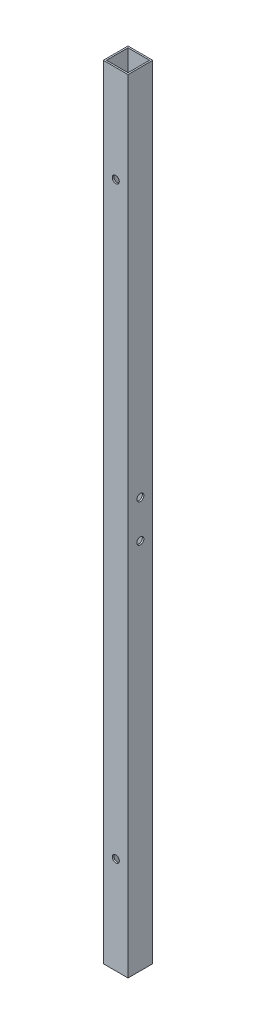
ISO-10303-21;
HEADER;
FILE_DESCRIPTION(('STEP AP214'),'2;1');
FILE_NAME('part.step','',(''),(''),'','','');
FILE_SCHEMA(('AUTOMOTIVE_DESIGN { 1 0 10303 214 1 1 1 1 }'));
ENDSEC;
DATA;
#1=APPLICATION_CONTEXT('core data for automotive mechanical design processes');
#2=APPLICATION_PROTOCOL_DEFINITION('international standard','automotive_design',2000,#1);
#3=PRODUCT_CONTEXT('',#1,'mechanical');
#4=PRODUCT('Part','Part','',(#3));
#5=PRODUCT_RELATED_PRODUCT_CATEGORY('part','',(#4));
#6=PRODUCT_DEFINITION_FORMATION('','',#4);
#7=PRODUCT_DEFINITION_CONTEXT('part definition',#1,'design');
#8=PRODUCT_DEFINITION('design','',#6,#7);
#9=PRODUCT_DEFINITION_SHAPE('','',#8);
#10=(LENGTH_UNIT() NAMED_UNIT(*) SI_UNIT(.MILLI.,.METRE.));
#11=(NAMED_UNIT(*) PLANE_ANGLE_UNIT() SI_UNIT($,.RADIAN.));
#12=(NAMED_UNIT(*) SI_UNIT($,.STERADIAN.) SOLID_ANGLE_UNIT());
#13=UNCERTAINTY_MEASURE_WITH_UNIT(LENGTH_MEASURE(1.E-05),#10,'distance_accuracy_value','');
#14=(GEOMETRIC_REPRESENTATION_CONTEXT(3) GLOBAL_UNCERTAINTY_ASSIGNED_CONTEXT((#13)) GLOBAL_UNIT_ASSIGNED_CONTEXT((#10,
#11,#12)) REPRESENTATION_CONTEXT('',''));
#15=CARTESIAN_POINT('',(0.,0.,0.));
#16=DIRECTION('',(0.,0.,1.));
#17=DIRECTION('',(1.,0.,0.));
#18=AXIS2_PLACEMENT_3D('',#15,#16,#17);
#19=CARTESIAN_POINT('',(0.,500.,0.));
#20=DIRECTION('',(0.,-1.,0.));
#21=DIRECTION('',(0.,0.,-1.));
#22=AXIS2_PLACEMENT_3D('',#19,#20,#21);
#23=PLANE('',#22);
#24=DIRECTION('',(0.,0.,-1.));
#25=VECTOR('',#24,1.);
#26=CARTESIAN_POINT('',(7.9,500.,7.9));
#27=LINE('',#26,#25);
#28=CARTESIAN_POINT('',(7.9,500.,7.9));
#29=VERTEX_POINT('',#28);
#30=CARTESIAN_POINT('',(7.9,500.,-7.9));
#31=VERTEX_POINT('',#30);
#32=EDGE_CURVE('E141',#29,#31,#27,.T.);
#33=ORIENTED_EDGE('',*,*,#32,.T.);
#34=DIRECTION('',(-1.,0.,0.));
#35=VECTOR('',#34,1.);
#36=CARTESIAN_POINT('',(-7.9,500.,-7.9));
#37=LINE('',#36,#35);
#38=CARTESIAN_POINT('',(-7.9,500.,-7.9));
#39=VERTEX_POINT('',#38);
#40=EDGE_CURVE('E144',#31,#39,#37,.T.);
#41=ORIENTED_EDGE('',*,*,#40,.T.);
#42=DIRECTION('',(0.,0.,1.));
#43=VECTOR('',#42,1.);
#44=CARTESIAN_POINT('',(-7.9,500.,7.9));
#45=LINE('',#44,#43);
#46=CARTESIAN_POINT('',(-7.9,500.,7.9));
#47=VERTEX_POINT('',#46);
#48=EDGE_CURVE('E147',#39,#47,#45,.T.);
#49=ORIENTED_EDGE('',*,*,#48,.T.);
#50=DIRECTION('',(1.,0.,0.));
#51=VECTOR('',#50,1.);
#52=CARTESIAN_POINT('',(-7.9,500.,7.9));
#53=LINE('',#52,#51);
#54=EDGE_CURVE('E149',#47,#29,#53,.T.);
#55=ORIENTED_EDGE('',*,*,#54,.T.);
#56=EDGE_LOOP('',(#33,#41,#49,#55));
#57=FACE_BOUND('',#56,.T.);
#58=DIRECTION('',(1.,0.,0.));
#59=VECTOR('',#58,1.);
#60=CARTESIAN_POINT('',(-6.9,500.,6.9));
#61=LINE('',#60,#59);
#62=CARTESIAN_POINT('',(-6.9,500.,6.9));
#63=VERTEX_POINT('',#62);
#64=CARTESIAN_POINT('',(6.9,500.,6.9));
#65=VERTEX_POINT('',#64);
#66=EDGE_CURVE('E103',#63,#65,#61,.T.);
#67=ORIENTED_EDGE('',*,*,#66,.F.);
#68=DIRECTION('',(0.,0.,1.));
#69=VECTOR('',#68,1.);
#70=CARTESIAN_POINT('',(-6.9,500.,6.9));
#71=LINE('',#70,#69);
#72=CARTESIAN_POINT('',(-6.9,500.,-6.9));
#73=VERTEX_POINT('',#72);
#74=EDGE_CURVE('E125',#73,#63,#71,.T.);
#75=ORIENTED_EDGE('',*,*,#74,.F.);
#76=DIRECTION('',(-1.,0.,0.));
#77=VECTOR('',#76,1.);
#78=CARTESIAN_POINT('',(-6.9,500.,-6.9));
#79=LINE('',#78,#77);
#80=CARTESIAN_POINT('',(6.9,500.,-6.9));
#81=VERTEX_POINT('',#80);
#82=EDGE_CURVE('E123',#81,#73,#79,.T.);
#83=ORIENTED_EDGE('',*,*,#82,.F.);
#84=DIRECTION('',(0.,0.,-1.));
#85=VECTOR('',#84,1.);
#86=CARTESIAN_POINT('',(6.9,500.,6.9));
#87=LINE('',#86,#85);
#88=EDGE_CURVE('E111',#65,#81,#87,.T.);
#89=ORIENTED_EDGE('',*,*,#88,.F.);
#90=EDGE_LOOP('',(#67,#75,#83,#89));
#91=FACE_BOUND('',#90,.T.);
#92=ADVANCED_FACE('F36',(#57,#91),#23,.F.);
#93=CARTESIAN_POINT('',(0.,0.,0.));
#94=DIRECTION('',(0.,-1.,0.));
#95=DIRECTION('',(0.,0.,-1.));
#96=AXIS2_PLACEMENT_3D('',#93,#94,#95);
#97=PLANE('',#96);
#98=DIRECTION('',(0.,0.,-1.));
#99=VECTOR('',#98,1.);
#100=CARTESIAN_POINT('',(7.9,0.,7.9));
#101=LINE('',#100,#99);
#102=CARTESIAN_POINT('',(7.9,0.,7.9));
#103=VERTEX_POINT('',#102);
#104=CARTESIAN_POINT('',(7.9,0.,-7.9));
#105=VERTEX_POINT('',#104);
#106=EDGE_CURVE('E119',#103,#105,#101,.T.);
#107=ORIENTED_EDGE('',*,*,#106,.F.);
#108=DIRECTION('',(1.,0.,0.));
#109=VECTOR('',#108,1.);
#110=CARTESIAN_POINT('',(-7.9,0.,7.9));
#111=LINE('',#110,#109);
#112=CARTESIAN_POINT('',(-7.9,0.,7.9));
#113=VERTEX_POINT('',#112);
#114=EDGE_CURVE('E145',#113,#103,#111,.T.);
#115=ORIENTED_EDGE('',*,*,#114,.F.);
#116=DIRECTION('',(0.,0.,1.));
#117=VECTOR('',#116,1.);
#118=CARTESIAN_POINT('',(-7.9,0.,7.9));
#119=LINE('',#118,#117);
#120=CARTESIAN_POINT('',(-7.9,0.,-7.9));
#121=VERTEX_POINT('',#120);
#122=EDGE_CURVE('E156',#121,#113,#119,.T.);
#123=ORIENTED_EDGE('',*,*,#122,.F.);
#124=DIRECTION('',(-1.,0.,0.));
#125=VECTOR('',#124,1.);
#126=CARTESIAN_POINT('',(-7.9,0.,-7.9));
#127=LINE('',#126,#125);
#128=EDGE_CURVE('E154',#105,#121,#127,.T.);
#129=ORIENTED_EDGE('',*,*,#128,.F.);
#130=EDGE_LOOP('',(#107,#115,#123,#129));
#131=FACE_BOUND('',#130,.T.);
#132=DIRECTION('',(0.,0.,1.));
#133=VECTOR('',#132,1.);
#134=CARTESIAN_POINT('',(-6.9,0.,6.9));
#135=LINE('',#134,#133);
#136=CARTESIAN_POINT('',(-6.9,0.,-6.9));
#137=VERTEX_POINT('',#136);
#138=CARTESIAN_POINT('',(-6.9,0.,6.9));
#139=VERTEX_POINT('',#138);
#140=EDGE_CURVE('E112',#137,#139,#135,.T.);
#141=ORIENTED_EDGE('',*,*,#140,.T.);
#142=DIRECTION('',(1.,0.,0.));
#143=VECTOR('',#142,1.);
#144=CARTESIAN_POINT('',(-6.9,0.,6.9));
#145=LINE('',#144,#143);
#146=CARTESIAN_POINT('',(6.9,0.,6.9));
#147=VERTEX_POINT('',#146);
#148=EDGE_CURVE('E61',#139,#147,#145,.T.);
#149=ORIENTED_EDGE('',*,*,#148,.T.);
#150=DIRECTION('',(0.,0.,-1.));
#151=VECTOR('',#150,1.);
#152=CARTESIAN_POINT('',(6.9,0.,6.9));
#153=LINE('',#152,#151);
#154=CARTESIAN_POINT('',(6.9,0.,-6.9));
#155=VERTEX_POINT('',#154);
#156=EDGE_CURVE('E118',#147,#155,#153,.T.);
#157=ORIENTED_EDGE('',*,*,#156,.T.);
#158=DIRECTION('',(-1.,0.,0.));
#159=VECTOR('',#158,1.);
#160=CARTESIAN_POINT('',(-6.9,0.,-6.9));
#161=LINE('',#160,#159);
#162=EDGE_CURVE('E133',#155,#137,#161,.T.);
#163=ORIENTED_EDGE('',*,*,#162,.T.);
#164=EDGE_LOOP('',(#141,#149,#157,#163));
#165=FACE_BOUND('',#164,.T.);
#166=ADVANCED_FACE('F245',(#131,#165),#97,.T.);
#167=CARTESIAN_POINT('',(7.9,500.,7.9));
#168=DIRECTION('',(-1.,0.,0.));
#169=DIRECTION('',(0.,0.,1.));
#170=AXIS2_PLACEMENT_3D('',#167,#168,#169);
#171=PLANE('',#170);
#172=CARTESIAN_POINT('',(7.9,262.,0.));
#173=DIRECTION('',(1.,0.,0.));
#174=DIRECTION('',(0.,0.,-1.));
#175=AXIS2_PLACEMENT_3D('',#172,#173,#174);
#176=CIRCLE('',#175,2.25);
#177=CARTESIAN_POINT('',(7.9,262.,-2.24999999999999));
#178=VERTEX_POINT('',#177);
#179=EDGE_CURVE('E182',#178,#178,#176,.T.);
#180=ORIENTED_EDGE('',*,*,#179,.F.);
#181=EDGE_LOOP('',(#180));
#182=FACE_BOUND('',#181,.T.);
#183=CARTESIAN_POINT('',(7.9,238.,0.));
#184=DIRECTION('',(1.,0.,0.));
#185=DIRECTION('',(0.,0.,1.));
#186=AXIS2_PLACEMENT_3D('',#183,#184,#185);
#187=CIRCLE('',#186,2.25);
#188=CARTESIAN_POINT('',(7.9,238.,2.25));
#189=VERTEX_POINT('',#188);
#190=EDGE_CURVE('E187',#189,#189,#187,.T.);
#191=ORIENTED_EDGE('',*,*,#190,.F.);
#192=EDGE_LOOP('',(#191));
#193=FACE_BOUND('',#192,.T.);
#194=ORIENTED_EDGE('',*,*,#106,.T.);
#195=DIRECTION('',(0.,-1.,0.));
#196=VECTOR('',#195,1.);
#197=CARTESIAN_POINT('',(7.9,500.,-7.9));
#198=LINE('',#197,#196);
#199=EDGE_CURVE('E11',#31,#105,#198,.T.);
#200=ORIENTED_EDGE('',*,*,#199,.F.);
#201=ORIENTED_EDGE('',*,*,#32,.F.);
#202=DIRECTION('',(0.,-1.,0.));
#203=VECTOR('',#202,1.);
#204=CARTESIAN_POINT('',(7.9,500.,7.9));
#205=LINE('',#204,#203);
#206=EDGE_CURVE('E151',#29,#103,#205,.T.);
#207=ORIENTED_EDGE('',*,*,#206,.T.);
#208=EDGE_LOOP('',(#194,#200,#201,#207));
#209=FACE_BOUND('',#208,.T.);
#210=ADVANCED_FACE('F38',(#182,#193,#209),#171,.F.);
#211=CARTESIAN_POINT('',(-7.9,500.,-7.9));
#212=DIRECTION('',(0.,0.,1.));
#213=DIRECTION('',(1.,0.,0.));
#214=AXIS2_PLACEMENT_3D('',#211,#212,#213);
#215=PLANE('',#214);
#216=CARTESIAN_POINT('',(0.0942662507711961,62.,-7.9));
#217=DIRECTION('',(0.,0.,-1.));
#218=DIRECTION('',(-1.,0.,0.));
#219=AXIS2_PLACEMENT_3D('',#216,#217,#218);
#220=CIRCLE('',#219,2.25);
#221=CARTESIAN_POINT('',(-2.1557337492288,62.,-7.9));
#222=VERTEX_POINT('',#221);
#223=EDGE_CURVE('E201',#222,#222,#220,.T.);
#224=ORIENTED_EDGE('',*,*,#223,.F.);
#225=EDGE_LOOP('',(#224));
#226=FACE_BOUND('',#225,.T.);
#227=CARTESIAN_POINT('',(0.0942662507712421,438.,-7.9));
#228=DIRECTION('',(0.,0.,-1.));
#229=DIRECTION('',(1.,0.,0.));
#230=AXIS2_PLACEMENT_3D('',#227,#228,#229);
#231=CIRCLE('',#230,2.25);
#232=CARTESIAN_POINT('',(2.34426625077124,438.,-7.9));
#233=VERTEX_POINT('',#232);
#234=EDGE_CURVE('E204',#233,#233,#231,.T.);
#235=ORIENTED_EDGE('',*,*,#234,.F.);
#236=EDGE_LOOP('',(#235));
#237=FACE_BOUND('',#236,.T.);
#238=ORIENTED_EDGE('',*,*,#128,.T.);
#239=DIRECTION('',(0.,-1.,0.));
#240=VECTOR('',#239,1.);
#241=CARTESIAN_POINT('',(-7.9,500.,-7.9));
#242=LINE('',#241,#240);
#243=EDGE_CURVE('E45',#39,#121,#242,.T.);
#244=ORIENTED_EDGE('',*,*,#243,.F.);
#245=ORIENTED_EDGE('',*,*,#40,.F.);
#246=ORIENTED_EDGE('',*,*,#199,.T.);
#247=EDGE_LOOP('',(#238,#244,#245,#246));
#248=FACE_BOUND('',#247,.T.);
#249=ADVANCED_FACE('F249',(#226,#237,#248),#215,.F.);
#250=CARTESIAN_POINT('',(-7.9,500.,7.9));
#251=DIRECTION('',(1.,0.,0.));
#252=DIRECTION('',(0.,0.,-1.));
#253=AXIS2_PLACEMENT_3D('',#250,#251,#252);
#254=PLANE('',#253);
#255=CARTESIAN_POINT('',(-7.9,262.,0.));
#256=DIRECTION('',(1.,0.,0.));
#257=DIRECTION('',(0.,0.,-1.));
#258=AXIS2_PLACEMENT_3D('',#255,#256,#257);
#259=CIRCLE('',#258,2.25);
#260=CARTESIAN_POINT('',(-7.9,262.,-2.24999999999999));
#261=VERTEX_POINT('',#260);
#262=EDGE_CURVE('E176',#261,#261,#259,.T.);
#263=ORIENTED_EDGE('',*,*,#262,.T.);
#264=EDGE_LOOP('',(#263));
#265=FACE_BOUND('',#264,.T.);
#266=CARTESIAN_POINT('',(-7.9,238.,0.));
#267=DIRECTION('',(1.,0.,0.));
#268=DIRECTION('',(0.,0.,1.));
#269=AXIS2_PLACEMENT_3D('',#266,#267,#268);
#270=CIRCLE('',#269,2.25);
#271=CARTESIAN_POINT('',(-7.9,238.,2.25));
#272=VERTEX_POINT('',#271);
#273=EDGE_CURVE('E192',#272,#272,#270,.T.);
#274=ORIENTED_EDGE('',*,*,#273,.T.);
#275=EDGE_LOOP('',(#274));
#276=FACE_BOUND('',#275,.T.);
#277=ORIENTED_EDGE('',*,*,#122,.T.);
#278=DIRECTION('',(0.,-1.,0.));
#279=VECTOR('',#278,1.);
#280=CARTESIAN_POINT('',(-7.9,500.,7.9));
#281=LINE('',#280,#279);
#282=EDGE_CURVE('E161',#47,#113,#281,.T.);
#283=ORIENTED_EDGE('',*,*,#282,.F.);
#284=ORIENTED_EDGE('',*,*,#48,.F.);
#285=ORIENTED_EDGE('',*,*,#243,.T.);
#286=EDGE_LOOP('',(#277,#283,#284,#285));
#287=FACE_BOUND('',#286,.T.);
#288=ADVANCED_FACE('F232',(#265,#276,#287),#254,.F.);
#289=CARTESIAN_POINT('',(-7.9,500.,7.9));
#290=DIRECTION('',(0.,0.,-1.));
#291=DIRECTION('',(-1.,0.,0.));
#292=AXIS2_PLACEMENT_3D('',#289,#290,#291);
#293=PLANE('',#292);
#294=CARTESIAN_POINT('',(0.0942662507711961,62.,7.9));
#295=DIRECTION('',(0.,0.,-1.));
#296=DIRECTION('',(-1.,0.,0.));
#297=AXIS2_PLACEMENT_3D('',#294,#295,#296);
#298=CIRCLE('',#297,2.25);
#299=CARTESIAN_POINT('',(-2.1557337492288,62.,7.9));
#300=VERTEX_POINT('',#299);
#301=EDGE_CURVE('E170',#300,#300,#298,.T.);
#302=ORIENTED_EDGE('',*,*,#301,.T.);
#303=EDGE_LOOP('',(#302));
#304=FACE_BOUND('',#303,.T.);
#305=CARTESIAN_POINT('',(0.0942662507712421,438.,7.9));
#306=DIRECTION('',(0.,0.,-1.));
#307=DIRECTION('',(1.,0.,0.));
#308=AXIS2_PLACEMENT_3D('',#305,#306,#307);
#309=CIRCLE('',#308,2.25);
#310=CARTESIAN_POINT('',(2.34426625077124,438.,7.9));
#311=VERTEX_POINT('',#310);
#312=EDGE_CURVE('E198',#311,#311,#309,.T.);
#313=ORIENTED_EDGE('',*,*,#312,.T.);
#314=EDGE_LOOP('',(#313));
#315=FACE_BOUND('',#314,.T.);
#316=ORIENTED_EDGE('',*,*,#114,.T.);
#317=ORIENTED_EDGE('',*,*,#206,.F.);
#318=ORIENTED_EDGE('',*,*,#54,.F.);
#319=ORIENTED_EDGE('',*,*,#282,.T.);
#320=EDGE_LOOP('',(#316,#317,#318,#319));
#321=FACE_BOUND('',#320,.T.);
#322=ADVANCED_FACE('F218',(#304,#315,#321),#293,.F.);
#323=CARTESIAN_POINT('',(-6.9,500.,6.9));
#324=DIRECTION('',(0.,0.,-1.));
#325=DIRECTION('',(-1.,0.,0.));
#326=AXIS2_PLACEMENT_3D('',#323,#324,#325);
#327=PLANE('',#326);
#328=CARTESIAN_POINT('',(0.0942662507711961,62.,6.9));
#329=DIRECTION('',(0.,0.,-1.));
#330=DIRECTION('',(-1.,0.,0.));
#331=AXIS2_PLACEMENT_3D('',#328,#329,#330);
#332=CIRCLE('',#331,2.25);
#333=CARTESIAN_POINT('',(-2.1557337492288,62.,6.9));
#334=VERTEX_POINT('',#333);
#335=EDGE_CURVE('E131',#334,#334,#332,.T.);
#336=ORIENTED_EDGE('',*,*,#335,.F.);
#337=EDGE_LOOP('',(#336));
#338=FACE_BOUND('',#337,.T.);
#339=CARTESIAN_POINT('',(0.0942662507712421,438.,6.9));
#340=DIRECTION('',(0.,0.,-1.));
#341=DIRECTION('',(-1.,0.,0.));
#342=AXIS2_PLACEMENT_3D('',#339,#340,#341);
#343=CIRCLE('',#342,2.25);
#344=CARTESIAN_POINT('',(-2.15573374922876,438.,6.9));
#345=VERTEX_POINT('',#344);
#346=EDGE_CURVE('E169',#345,#345,#343,.T.);
#347=ORIENTED_EDGE('',*,*,#346,.F.);
#348=EDGE_LOOP('',(#347));
#349=FACE_BOUND('',#348,.T.);
#350=ORIENTED_EDGE('',*,*,#148,.F.);
#351=DIRECTION('',(0.,-1.,0.));
#352=VECTOR('',#351,1.);
#353=CARTESIAN_POINT('',(-6.9,500.,6.9));
#354=LINE('',#353,#352);
#355=EDGE_CURVE('E107',#63,#139,#354,.T.);
#356=ORIENTED_EDGE('',*,*,#355,.F.);
#357=ORIENTED_EDGE('',*,*,#66,.T.);
#358=DIRECTION('',(0.,-1.,0.));
#359=VECTOR('',#358,1.);
#360=CARTESIAN_POINT('',(6.9,500.,6.9));
#361=LINE('',#360,#359);
#362=EDGE_CURVE('E106',#65,#147,#361,.T.);
#363=ORIENTED_EDGE('',*,*,#362,.T.);
#364=EDGE_LOOP('',(#350,#356,#357,#363));
#365=FACE_BOUND('',#364,.T.);
#366=ADVANCED_FACE('F105',(#338,#349,#365),#327,.T.);
#367=CARTESIAN_POINT('',(6.9,500.,6.9));
#368=DIRECTION('',(-1.,0.,0.));
#369=DIRECTION('',(0.,0.,1.));
#370=AXIS2_PLACEMENT_3D('',#367,#368,#369);
#371=PLANE('',#370);
#372=CARTESIAN_POINT('',(6.9,262.,0.));
#373=DIRECTION('',(-1.,0.,0.));
#374=DIRECTION('',(0.,0.,1.));
#375=AXIS2_PLACEMENT_3D('',#372,#373,#374);
#376=CIRCLE('',#375,2.25);
#377=CARTESIAN_POINT('',(6.9,262.,2.25000000000001));
#378=VERTEX_POINT('',#377);
#379=EDGE_CURVE('E195',#378,#378,#376,.T.);
#380=ORIENTED_EDGE('',*,*,#379,.F.);
#381=EDGE_LOOP('',(#380));
#382=FACE_BOUND('',#381,.T.);
#383=CARTESIAN_POINT('',(6.9,238.,0.));
#384=DIRECTION('',(-1.,0.,0.));
#385=DIRECTION('',(0.,0.,1.));
#386=AXIS2_PLACEMENT_3D('',#383,#384,#385);
#387=CIRCLE('',#386,2.25);
#388=CARTESIAN_POINT('',(6.9,238.,2.25));
#389=VERTEX_POINT('',#388);
#390=EDGE_CURVE('E175',#389,#389,#387,.T.);
#391=ORIENTED_EDGE('',*,*,#390,.F.);
#392=EDGE_LOOP('',(#391));
#393=FACE_BOUND('',#392,.T.);
#394=ORIENTED_EDGE('',*,*,#156,.F.);
#395=ORIENTED_EDGE('',*,*,#362,.F.);
#396=ORIENTED_EDGE('',*,*,#88,.T.);
#397=DIRECTION('',(0.,-1.,0.));
#398=VECTOR('',#397,1.);
#399=CARTESIAN_POINT('',(6.9,500.,-6.9));
#400=LINE('',#399,#398);
#401=EDGE_CURVE('E120',#81,#155,#400,.T.);
#402=ORIENTED_EDGE('',*,*,#401,.T.);
#403=EDGE_LOOP('',(#394,#395,#396,#402));
#404=FACE_BOUND('',#403,.T.);
#405=ADVANCED_FACE('F115',(#382,#393,#404),#371,.T.);
#406=CARTESIAN_POINT('',(-6.9,500.,-6.9));
#407=DIRECTION('',(0.,0.,1.));
#408=DIRECTION('',(1.,0.,0.));
#409=AXIS2_PLACEMENT_3D('',#406,#407,#408);
#410=PLANE('',#409);
#411=CARTESIAN_POINT('',(0.0942662507711961,62.,-6.9));
#412=DIRECTION('',(0.,0.,1.));
#413=DIRECTION('',(1.,0.,0.));
#414=AXIS2_PLACEMENT_3D('',#411,#412,#413);
#415=CIRCLE('',#414,2.25);
#416=CARTESIAN_POINT('',(2.3442662507712,62.,-6.9));
#417=VERTEX_POINT('',#416);
#418=EDGE_CURVE('E171',#417,#417,#415,.T.);
#419=ORIENTED_EDGE('',*,*,#418,.F.);
#420=EDGE_LOOP('',(#419));
#421=FACE_BOUND('',#420,.T.);
#422=CARTESIAN_POINT('',(0.0942662507712421,438.,-6.9));
#423=DIRECTION('',(0.,0.,1.));
#424=DIRECTION('',(1.,0.,0.));
#425=AXIS2_PLACEMENT_3D('',#422,#423,#424);
#426=CIRCLE('',#425,2.25);
#427=CARTESIAN_POINT('',(2.34426625077124,438.,-6.9));
#428=VERTEX_POINT('',#427);
#429=EDGE_CURVE('E166',#428,#428,#426,.T.);
#430=ORIENTED_EDGE('',*,*,#429,.F.);
#431=EDGE_LOOP('',(#430));
#432=FACE_BOUND('',#431,.T.);
#433=ORIENTED_EDGE('',*,*,#162,.F.);
#434=ORIENTED_EDGE('',*,*,#401,.F.);
#435=ORIENTED_EDGE('',*,*,#82,.T.);
#436=DIRECTION('',(0.,-1.,0.));
#437=VECTOR('',#436,1.);
#438=CARTESIAN_POINT('',(-6.9,500.,-6.9));
#439=LINE('',#438,#437);
#440=EDGE_CURVE('E53',#73,#137,#439,.T.);
#441=ORIENTED_EDGE('',*,*,#440,.T.);
#442=EDGE_LOOP('',(#433,#434,#435,#441));
#443=FACE_BOUND('',#442,.T.);
#444=ADVANCED_FACE('F269',(#421,#432,#443),#410,.T.);
#445=CARTESIAN_POINT('',(-6.9,500.,6.9));
#446=DIRECTION('',(1.,0.,0.));
#447=DIRECTION('',(0.,0.,-1.));
#448=AXIS2_PLACEMENT_3D('',#445,#446,#447);
#449=PLANE('',#448);
#450=CARTESIAN_POINT('',(-6.9,262.,0.));
#451=DIRECTION('',(1.,0.,0.));
#452=DIRECTION('',(0.,0.,-1.));
#453=AXIS2_PLACEMENT_3D('',#450,#451,#452);
#454=CIRCLE('',#453,2.25);
#455=CARTESIAN_POINT('',(-6.9,262.,-2.24999999999999));
#456=VERTEX_POINT('',#455);
#457=EDGE_CURVE('E40',#456,#456,#454,.T.);
#458=ORIENTED_EDGE('',*,*,#457,.F.);
#459=EDGE_LOOP('',(#458));
#460=FACE_BOUND('',#459,.T.);
#461=CARTESIAN_POINT('',(-6.9,238.,0.));
#462=DIRECTION('',(1.,0.,0.));
#463=DIRECTION('',(0.,0.,-1.));
#464=AXIS2_PLACEMENT_3D('',#461,#462,#463);
#465=CIRCLE('',#464,2.25);
#466=CARTESIAN_POINT('',(-6.9,238.,-2.25));
#467=VERTEX_POINT('',#466);
#468=EDGE_CURVE('E173',#467,#467,#465,.T.);
#469=ORIENTED_EDGE('',*,*,#468,.F.);
#470=EDGE_LOOP('',(#469));
#471=FACE_BOUND('',#470,.T.);
#472=ORIENTED_EDGE('',*,*,#140,.F.);
#473=ORIENTED_EDGE('',*,*,#440,.F.);
#474=ORIENTED_EDGE('',*,*,#74,.T.);
#475=ORIENTED_EDGE('',*,*,#355,.T.);
#476=EDGE_LOOP('',(#472,#473,#474,#475));
#477=FACE_BOUND('',#476,.T.);
#478=ADVANCED_FACE('F273',(#460,#471,#477),#449,.T.);
#479=CARTESIAN_POINT('',(0.0942662507712421,438.,7.9));
#480=DIRECTION('',(0.,0.,-1.));
#481=DIRECTION('',(-1.,0.,0.));
#482=AXIS2_PLACEMENT_3D('',#479,#480,#481);
#483=CYLINDRICAL_SURFACE('',#482,2.25);
#484=ORIENTED_EDGE('',*,*,#429,.T.);
#485=EDGE_LOOP('',(#484));
#486=FACE_BOUND('',#485,.T.);
#487=ORIENTED_EDGE('',*,*,#234,.T.);
#488=EDGE_LOOP('',(#487));
#489=FACE_BOUND('',#488,.T.);
#490=ADVANCED_FACE('F227',(#486,#489),#483,.F.);
#491=CARTESIAN_POINT('',(0.0942662507711961,62.,7.9));
#492=DIRECTION('',(0.,0.,-1.));
#493=DIRECTION('',(-1.,0.,0.));
#494=AXIS2_PLACEMENT_3D('',#491,#492,#493);
#495=CYLINDRICAL_SURFACE('',#494,2.25);
#496=ORIENTED_EDGE('',*,*,#418,.T.);
#497=EDGE_LOOP('',(#496));
#498=FACE_BOUND('',#497,.T.);
#499=ORIENTED_EDGE('',*,*,#223,.T.);
#500=EDGE_LOOP('',(#499));
#501=FACE_BOUND('',#500,.T.);
#502=ADVANCED_FACE('F225',(#498,#501),#495,.F.);
#503=ORIENTED_EDGE('',*,*,#346,.T.);
#504=EDGE_LOOP('',(#503));
#505=FACE_BOUND('',#504,.T.);
#506=ORIENTED_EDGE('',*,*,#312,.F.);
#507=EDGE_LOOP('',(#506));
#508=FACE_BOUND('',#507,.T.);
#509=ADVANCED_FACE('F222',(#505,#508),#483,.F.);
#510=ORIENTED_EDGE('',*,*,#335,.T.);
#511=EDGE_LOOP('',(#510));
#512=FACE_BOUND('',#511,.T.);
#513=ORIENTED_EDGE('',*,*,#301,.F.);
#514=EDGE_LOOP('',(#513));
#515=FACE_BOUND('',#514,.T.);
#516=ADVANCED_FACE('F213',(#512,#515),#495,.F.);
#517=CARTESIAN_POINT('',(-7.9,238.,0.));
#518=DIRECTION('',(1.,0.,0.));
#519=DIRECTION('',(0.,0.,-1.));
#520=AXIS2_PLACEMENT_3D('',#517,#518,#519);
#521=CYLINDRICAL_SURFACE('',#520,2.25);
#522=ORIENTED_EDGE('',*,*,#468,.T.);
#523=EDGE_LOOP('',(#522));
#524=FACE_BOUND('',#523,.T.);
#525=ORIENTED_EDGE('',*,*,#273,.F.);
#526=EDGE_LOOP('',(#525));
#527=FACE_BOUND('',#526,.T.);
#528=ADVANCED_FACE('F283',(#524,#527),#521,.F.);
#529=CARTESIAN_POINT('',(-7.9,262.,0.));
#530=DIRECTION('',(1.,0.,0.));
#531=DIRECTION('',(0.,0.,-1.));
#532=AXIS2_PLACEMENT_3D('',#529,#530,#531);
#533=CYLINDRICAL_SURFACE('',#532,2.25);
#534=ORIENTED_EDGE('',*,*,#457,.T.);
#535=EDGE_LOOP('',(#534));
#536=FACE_BOUND('',#535,.T.);
#537=ORIENTED_EDGE('',*,*,#262,.F.);
#538=EDGE_LOOP('',(#537));
#539=FACE_BOUND('',#538,.T.);
#540=ADVANCED_FACE('F286',(#536,#539),#533,.F.);
#541=ORIENTED_EDGE('',*,*,#390,.T.);
#542=EDGE_LOOP('',(#541));
#543=FACE_BOUND('',#542,.T.);
#544=ORIENTED_EDGE('',*,*,#190,.T.);
#545=EDGE_LOOP('',(#544));
#546=FACE_BOUND('',#545,.T.);
#547=ADVANCED_FACE('F287',(#543,#546),#521,.F.);
#548=ORIENTED_EDGE('',*,*,#379,.T.);
#549=EDGE_LOOP('',(#548));
#550=FACE_BOUND('',#549,.T.);
#551=ORIENTED_EDGE('',*,*,#179,.T.);
#552=EDGE_LOOP('',(#551));
#553=FACE_BOUND('',#552,.T.);
#554=ADVANCED_FACE('F290',(#550,#553),#533,.F.);
#555=CLOSED_SHELL('',(#92,#166,#210,#249,#288,#322,#366,#405,#444,#478,#490,#502,#509,#516,#528,
#540,#547,#554));
#556=MANIFOLD_SOLID_BREP('B2',#555);
#557=ADVANCED_BREP_SHAPE_REPRESENTATION('',(#18,#556),#14);
#558=SHAPE_DEFINITION_REPRESENTATION(#9,#557);
ENDSEC;
END-ISO-10303-21;
